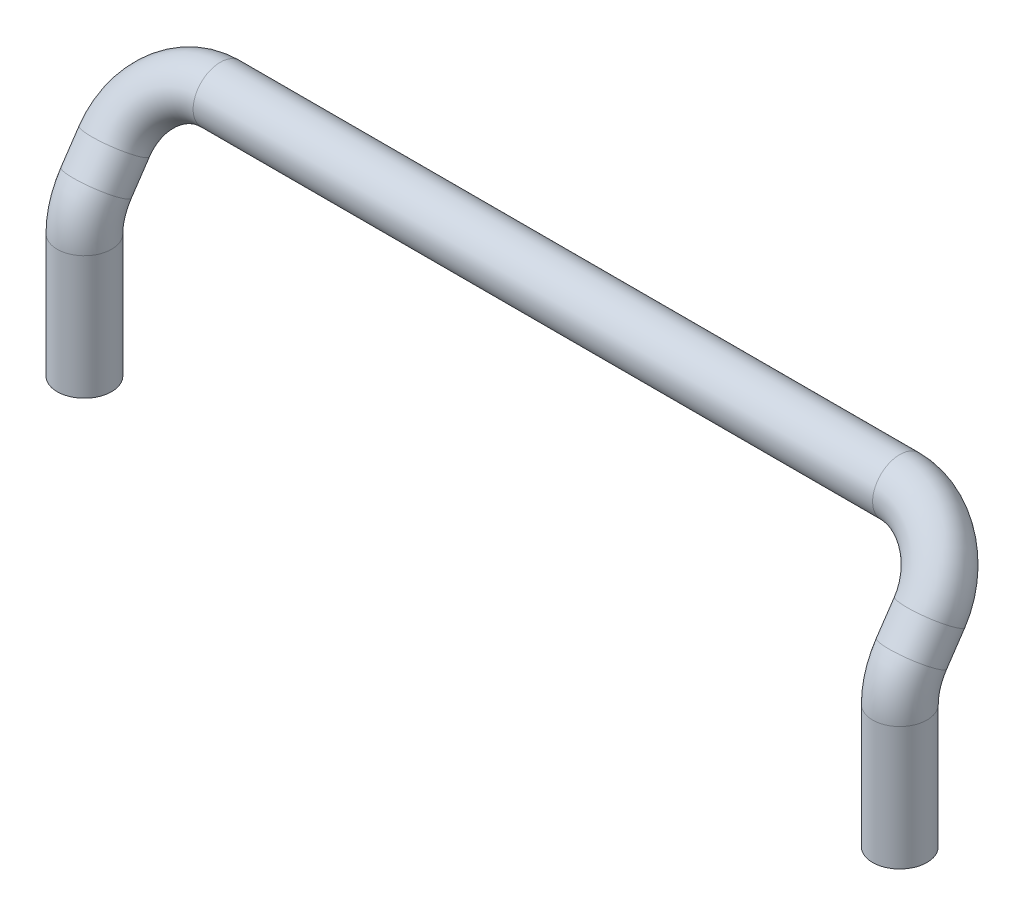
ISO-10303-21;
HEADER;
FILE_DESCRIPTION(('STEP AP214'),'2;1');
FILE_NAME('part.step','',(''),(''),'','','');
FILE_SCHEMA(('AUTOMOTIVE_DESIGN { 1 0 10303 214 1 1 1 1 }'));
ENDSEC;
DATA;
#1=APPLICATION_CONTEXT('core data for automotive mechanical design processes');
#2=APPLICATION_PROTOCOL_DEFINITION('international standard','automotive_design',2000,#1);
#3=PRODUCT_CONTEXT('',#1,'mechanical');
#4=PRODUCT('Part','Part','',(#3));
#5=PRODUCT_RELATED_PRODUCT_CATEGORY('part','',(#4));
#6=PRODUCT_DEFINITION_FORMATION('','',#4);
#7=PRODUCT_DEFINITION_CONTEXT('part definition',#1,'design');
#8=PRODUCT_DEFINITION('design','',#6,#7);
#9=PRODUCT_DEFINITION_SHAPE('','',#8);
#10=(LENGTH_UNIT() NAMED_UNIT(*) SI_UNIT(.MILLI.,.METRE.));
#11=(NAMED_UNIT(*) PLANE_ANGLE_UNIT() SI_UNIT($,.RADIAN.));
#12=(NAMED_UNIT(*) SI_UNIT($,.STERADIAN.) SOLID_ANGLE_UNIT());
#13=UNCERTAINTY_MEASURE_WITH_UNIT(LENGTH_MEASURE(1.E-05),#10,'distance_accuracy_value','');
#14=(GEOMETRIC_REPRESENTATION_CONTEXT(3) GLOBAL_UNCERTAINTY_ASSIGNED_CONTEXT((#13)) GLOBAL_UNIT_ASSIGNED_CONTEXT((#10,
#11,#12)) REPRESENTATION_CONTEXT('',''));
#15=CARTESIAN_POINT('',(0.,0.,0.));
#16=DIRECTION('',(0.,0.,1.));
#17=DIRECTION('',(1.,0.,0.));
#18=AXIS2_PLACEMENT_3D('',#15,#16,#17);
#19=CARTESIAN_POINT('',(120.,18.16,0.));
#20=DIRECTION('',(0.,-1.,0.));
#21=DIRECTION('',(0.,0.,-1.));
#22=AXIS2_PLACEMENT_3D('',#19,#20,#21);
#23=CYLINDRICAL_SURFACE('',#22,4.);
#24=CARTESIAN_POINT('',(120.,18.16,0.));
#25=DIRECTION('',(0.,-1.,0.));
#26=DIRECTION('',(0.,0.,1.));
#27=AXIS2_PLACEMENT_3D('',#24,#25,#26);
#28=CIRCLE('',#27,4.);
#29=CARTESIAN_POINT('',(120.,18.16,3.99999999999999));
#30=VERTEX_POINT('',#29);
#31=EDGE_CURVE('E45',#30,#30,#28,.T.);
#32=ORIENTED_EDGE('',*,*,#31,.T.);
#33=EDGE_LOOP('',(#32));
#34=FACE_BOUND('',#33,.T.);
#35=CARTESIAN_POINT('',(120.,0.,0.));
#36=DIRECTION('',(0.,-1.,0.));
#37=DIRECTION('',(0.,0.,1.));
#38=AXIS2_PLACEMENT_3D('',#35,#36,#37);
#39=CIRCLE('',#38,4.);
#40=CARTESIAN_POINT('',(120.,0.,3.99999999999999));
#41=VERTEX_POINT('',#40);
#42=EDGE_CURVE('E11',#41,#41,#39,.T.);
#43=ORIENTED_EDGE('',*,*,#42,.F.);
#44=EDGE_LOOP('',(#43));
#45=FACE_BOUND('',#44,.T.);
#46=ADVANCED_FACE('F38',(#34,#45),#23,.T.);
#47=CARTESIAN_POINT('',(120.,18.16,-10.));
#48=DIRECTION('',(1.,0.,0.));
#49=DIRECTION('',(0.,1.,0.));
#50=AXIS2_PLACEMENT_3D('',#47,#48,#49);
#51=TOROIDAL_SURFACE('',#50,9.99999999999999,4.);
#52=CARTESIAN_POINT('',(120.,23.7653811659193,-1.71871374816947));
#53=DIRECTION('',(0.,-0.828128625183053,0.560538116591929));
#54=DIRECTION('',(0.,0.560538116591929,0.828128625183054));
#55=AXIS2_PLACEMENT_3D('',#52,#53,#54);
#56=CIRCLE('',#55,4.);
#57=CARTESIAN_POINT('',(120.,26.007533632287,1.59380075256275));
#58=VERTEX_POINT('',#57);
#59=EDGE_CURVE('E93',#58,#58,#56,.T.);
#60=CARTESIAN_POINT('',(120.,18.16,-10.));
#61=DIRECTION('',(1.,0.,0.));
#62=DIRECTION('',(0.,1.,0.));
#63=AXIS2_PLACEMENT_3D('',#60,#61,#62);
#64=CIRCLE('',#63,14.);
#65=EDGE_CURVE('',#58,#30,#64,.T.);
#66=ORIENTED_EDGE('',*,*,#59,.T.);
#67=ORIENTED_EDGE('',*,*,#31,.F.);
#68=ORIENTED_EDGE('',*,*,#65,.T.);
#69=ORIENTED_EDGE('',*,*,#65,.F.);
#70=EDGE_LOOP('',(#66,#68,#67,#69));
#71=FACE_BOUND('',#70,.T.);
#72=ADVANCED_FACE('F100',(#71),#51,.T.);
#73=CARTESIAN_POINT('',(120.,27.7187137481694,-4.39461883408072));
#74=DIRECTION('',(0.,-0.828128625183053,0.560538116591929));
#75=DIRECTION('',(0.,-0.560538116591929,-0.828128625183053));
#76=AXIS2_PLACEMENT_3D('',#73,#74,#75);
#77=CYLINDRICAL_SURFACE('',#76,4.);
#78=CARTESIAN_POINT('',(120.,27.7187137481694,-4.39461883408072));
#79=DIRECTION('',(0.,-0.828128625183053,0.560538116591929));
#80=DIRECTION('',(0.,0.560538116591929,0.828128625183054));
#81=AXIS2_PLACEMENT_3D('',#78,#79,#80);
#82=CIRCLE('',#81,4.);
#83=CARTESIAN_POINT('',(124.,27.7187137481694,-4.39461883408072));
#84=VERTEX_POINT('',#83);
#85=EDGE_CURVE('E90',#84,#84,#82,.T.);
#86=ORIENTED_EDGE('',*,*,#85,.T.);
#87=EDGE_LOOP('',(#86));
#88=FACE_BOUND('',#87,.T.);
#89=ORIENTED_EDGE('',*,*,#59,.F.);
#90=EDGE_LOOP('',(#89));
#91=FACE_BOUND('',#90,.T.);
#92=ADVANCED_FACE('F102',(#88,#91),#77,.T.);
#93=CARTESIAN_POINT('',(110.,27.7187137481695,-4.39461883408072));
#94=DIRECTION('',(0.,-0.560538116591929,-0.828128625183053));
#95=DIRECTION('',(0.,0.828128625183053,-0.560538116591929));
#96=AXIS2_PLACEMENT_3D('',#93,#94,#95);
#97=TOROIDAL_SURFACE('',#96,9.99999999999999,4.);
#98=CARTESIAN_POINT('',(110.,36.,-10.));
#99=DIRECTION('',(1.,0.,0.));
#100=DIRECTION('',(0.,0.560538116591929,0.828128625183053));
#101=AXIS2_PLACEMENT_3D('',#98,#99,#100);
#102=CIRCLE('',#101,4.);
#103=CARTESIAN_POINT('',(110.,39.3125145007322,-12.2421524663677));
#104=VERTEX_POINT('',#103);
#105=EDGE_CURVE('E87',#104,#104,#102,.T.);
#106=CARTESIAN_POINT('',(110.,27.7187137481695,-4.39461883408072));
#107=DIRECTION('',(0.,-0.560538116591929,-0.828128625183053));
#108=DIRECTION('',(0.,0.828128625183053,-0.560538116591929));
#109=AXIS2_PLACEMENT_3D('',#106,#107,#108);
#110=CIRCLE('',#109,14.);
#111=EDGE_CURVE('',#104,#84,#110,.T.);
#112=ORIENTED_EDGE('',*,*,#105,.T.);
#113=ORIENTED_EDGE('',*,*,#85,.F.);
#114=ORIENTED_EDGE('',*,*,#111,.T.);
#115=ORIENTED_EDGE('',*,*,#111,.F.);
#116=EDGE_LOOP('',(#112,#114,#113,#115));
#117=FACE_BOUND('',#116,.T.);
#118=ADVANCED_FACE('F108',(#117),#97,.T.);
#119=CARTESIAN_POINT('',(10.,36.,-10.));
#120=DIRECTION('',(1.,0.,0.));
#121=DIRECTION('',(0.,1.,0.));
#122=AXIS2_PLACEMENT_3D('',#119,#120,#121);
#123=CYLINDRICAL_SURFACE('',#122,4.);
#124=CARTESIAN_POINT('',(10.,36.,-10.));
#125=DIRECTION('',(1.,0.,0.));
#126=DIRECTION('',(0.,0.560538116591929,0.828128625183053));
#127=AXIS2_PLACEMENT_3D('',#124,#125,#126);
#128=CIRCLE('',#127,4.);
#129=CARTESIAN_POINT('',(10.,39.3125145007322,-12.2421524663677));
#130=VERTEX_POINT('',#129);
#131=EDGE_CURVE('E84',#130,#130,#128,.T.);
#132=ORIENTED_EDGE('',*,*,#131,.T.);
#133=EDGE_LOOP('',(#132));
#134=FACE_BOUND('',#133,.T.);
#135=ORIENTED_EDGE('',*,*,#105,.F.);
#136=EDGE_LOOP('',(#135));
#137=FACE_BOUND('',#136,.T.);
#138=ADVANCED_FACE('F114',(#134,#137),#123,.T.);
#139=CARTESIAN_POINT('',(10.,27.7187137481695,-4.39461883408072));
#140=DIRECTION('',(0.,-0.560538116591929,-0.828128625183053));
#141=DIRECTION('',(0.,0.828128625183053,-0.560538116591929));
#142=AXIS2_PLACEMENT_3D('',#139,#140,#141);
#143=TOROIDAL_SURFACE('',#142,10.,4.);
#144=CARTESIAN_POINT('',(0.,27.7187137481695,-4.39461883408072));
#145=DIRECTION('',(0.,0.828128625183053,-0.560538116591929));
#146=DIRECTION('',(0.,0.560538116591929,0.828128625183053));
#147=AXIS2_PLACEMENT_3D('',#144,#145,#146);
#148=CIRCLE('',#147,4.);
#149=CARTESIAN_POINT('',(-4.,27.7187137481695,-4.39461883408072));
#150=VERTEX_POINT('',#149);
#151=EDGE_CURVE('E81',#150,#150,#148,.T.);
#152=CARTESIAN_POINT('',(10.,27.7187137481695,-4.39461883408072));
#153=DIRECTION('',(0.,-0.560538116591929,-0.828128625183053));
#154=DIRECTION('',(0.,0.828128625183053,-0.560538116591929));
#155=AXIS2_PLACEMENT_3D('',#152,#153,#154);
#156=CIRCLE('',#155,14.);
#157=EDGE_CURVE('',#150,#130,#156,.T.);
#158=ORIENTED_EDGE('',*,*,#151,.T.);
#159=ORIENTED_EDGE('',*,*,#131,.F.);
#160=ORIENTED_EDGE('',*,*,#157,.T.);
#161=ORIENTED_EDGE('',*,*,#157,.F.);
#162=EDGE_LOOP('',(#158,#160,#159,#161));
#163=FACE_BOUND('',#162,.T.);
#164=ADVANCED_FACE('F118',(#163),#143,.T.);
#165=CARTESIAN_POINT('',(0.,23.7653811659193,-1.71871374816947));
#166=DIRECTION('',(0.,0.828128625183053,-0.560538116591928));
#167=DIRECTION('',(0.,0.560538116591929,0.828128625183053));
#168=AXIS2_PLACEMENT_3D('',#165,#166,#167);
#169=CYLINDRICAL_SURFACE('',#168,4.);
#170=CARTESIAN_POINT('',(0.,23.7653811659193,-1.71871374816947));
#171=DIRECTION('',(0.,0.828128625183053,-0.560538116591929));
#172=DIRECTION('',(0.,0.560538116591929,0.828128625183053));
#173=AXIS2_PLACEMENT_3D('',#170,#171,#172);
#174=CIRCLE('',#173,4.);
#175=CARTESIAN_POINT('',(0.,26.007533632287,1.59380075256274));
#176=VERTEX_POINT('',#175);
#177=EDGE_CURVE('E76',#176,#176,#174,.T.);
#178=ORIENTED_EDGE('',*,*,#177,.T.);
#179=EDGE_LOOP('',(#178));
#180=FACE_BOUND('',#179,.T.);
#181=ORIENTED_EDGE('',*,*,#151,.F.);
#182=EDGE_LOOP('',(#181));
#183=FACE_BOUND('',#182,.T.);
#184=ADVANCED_FACE('F122',(#180,#183),#169,.T.);
#185=CARTESIAN_POINT('',(0.,18.16,-10.));
#186=DIRECTION('',(-1.,0.,0.));
#187=DIRECTION('',(0.,0.,1.));
#188=AXIS2_PLACEMENT_3D('',#185,#186,#187);
#189=TOROIDAL_SURFACE('',#188,10.,4.);
#190=CARTESIAN_POINT('',(0.,18.16,0.));
#191=DIRECTION('',(0.,1.,0.));
#192=DIRECTION('',(0.,0.,1.));
#193=AXIS2_PLACEMENT_3D('',#190,#191,#192);
#194=CIRCLE('',#193,4.);
#195=CARTESIAN_POINT('',(0.,18.16,4.));
#196=VERTEX_POINT('',#195);
#197=EDGE_CURVE('E73',#196,#196,#194,.T.);
#198=CARTESIAN_POINT('',(0.,18.16,-10.));
#199=DIRECTION('',(-1.,0.,0.));
#200=DIRECTION('',(0.,0.,1.));
#201=AXIS2_PLACEMENT_3D('',#198,#199,#200);
#202=CIRCLE('',#201,14.);
#203=EDGE_CURVE('',#196,#176,#202,.T.);
#204=ORIENTED_EDGE('',*,*,#197,.T.);
#205=ORIENTED_EDGE('',*,*,#177,.F.);
#206=ORIENTED_EDGE('',*,*,#203,.T.);
#207=ORIENTED_EDGE('',*,*,#203,.F.);
#208=EDGE_LOOP('',(#204,#206,#205,#207));
#209=FACE_BOUND('',#208,.T.);
#210=ADVANCED_FACE('F126',(#209),#189,.T.);
#211=CARTESIAN_POINT('',(0.,18.16,0.));
#212=DIRECTION('',(0.,-1.,0.));
#213=DIRECTION('',(0.,0.,-1.));
#214=AXIS2_PLACEMENT_3D('',#211,#212,#213);
#215=CYLINDRICAL_SURFACE('',#214,4.);
#216=ORIENTED_EDGE('',*,*,#197,.F.);
#217=EDGE_LOOP('',(#216));
#218=FACE_BOUND('',#217,.T.);
#219=CARTESIAN_POINT('',(0.,0.,0.));
#220=DIRECTION('',(0.,1.,0.));
#221=DIRECTION('',(0.,0.,1.));
#222=AXIS2_PLACEMENT_3D('',#219,#220,#221);
#223=CIRCLE('',#222,4.);
#224=CARTESIAN_POINT('',(0.,0.,4.));
#225=VERTEX_POINT('',#224);
#226=EDGE_CURVE('E72',#225,#225,#223,.T.);
#227=ORIENTED_EDGE('',*,*,#226,.T.);
#228=EDGE_LOOP('',(#227));
#229=FACE_BOUND('',#228,.T.);
#230=ADVANCED_FACE('F130',(#218,#229),#215,.T.);
#231=CARTESIAN_POINT('',(120.,0.,0.));
#232=DIRECTION('',(0.,-1.,0.));
#233=DIRECTION('',(0.,0.,1.));
#234=AXIS2_PLACEMENT_3D('',#231,#232,#233);
#235=PLANE('',#234);
#236=CARTESIAN_POINT('',(120.,0.,0.));
#237=DIRECTION('',(0.,-1.,0.));
#238=DIRECTION('',(0.,0.,-1.));
#239=AXIS2_PLACEMENT_3D('',#236,#237,#238);
#240=CIRCLE('',#239,2.067);
#241=CARTESIAN_POINT('',(120.,0.,-2.067));
#242=VERTEX_POINT('',#241);
#243=EDGE_CURVE('E61',#242,#242,#240,.T.);
#244=ORIENTED_EDGE('',*,*,#243,.F.);
#245=EDGE_LOOP('',(#244));
#246=FACE_BOUND('',#245,.T.);
#247=ORIENTED_EDGE('',*,*,#42,.T.);
#248=EDGE_LOOP('',(#247));
#249=FACE_BOUND('',#248,.T.);
#250=ADVANCED_FACE('F134',(#246,#249),#235,.T.);
#251=CARTESIAN_POINT('',(0.,0.,0.));
#252=DIRECTION('',(0.,1.,0.));
#253=DIRECTION('',(0.,0.,1.));
#254=AXIS2_PLACEMENT_3D('',#251,#252,#253);
#255=PLANE('',#254);
#256=CARTESIAN_POINT('',(0.,0.,0.));
#257=DIRECTION('',(0.,-1.,0.));
#258=DIRECTION('',(0.,0.,-1.));
#259=AXIS2_PLACEMENT_3D('',#256,#257,#258);
#260=CIRCLE('',#259,2.067);
#261=CARTESIAN_POINT('',(0.,0.,-2.067));
#262=VERTEX_POINT('',#261);
#263=EDGE_CURVE('E62',#262,#262,#260,.T.);
#264=ORIENTED_EDGE('',*,*,#263,.F.);
#265=EDGE_LOOP('',(#264));
#266=FACE_BOUND('',#265,.T.);
#267=ORIENTED_EDGE('',*,*,#226,.F.);
#268=EDGE_LOOP('',(#267));
#269=FACE_BOUND('',#268,.T.);
#270=ADVANCED_FACE('F136',(#266,#269),#255,.F.);
#271=CARTESIAN_POINT('',(120.,12.,0.));
#272=DIRECTION('',(0.,-1.,0.));
#273=DIRECTION('',(0.,0.,-1.));
#274=AXIS2_PLACEMENT_3D('',#271,#272,#273);
#275=CONICAL_SURFACE('',#274,2.067,1.02974425867665);
#276=CARTESIAN_POINT('',(120.,13.24197889953,0.));
#277=VERTEX_POINT('',#276);
#278=VERTEX_LOOP('',#277);
#279=FACE_BOUND('',#278,.T.);
#280=CARTESIAN_POINT('',(120.,12.,0.));
#281=DIRECTION('',(0.,-1.,0.));
#282=DIRECTION('',(0.,0.,-1.));
#283=AXIS2_PLACEMENT_3D('',#280,#281,#282);
#284=CIRCLE('',#283,2.067);
#285=CARTESIAN_POINT('',(120.,12.,-2.067));
#286=VERTEX_POINT('',#285);
#287=EDGE_CURVE('E65',#286,#286,#284,.T.);
#288=ORIENTED_EDGE('',*,*,#287,.T.);
#289=EDGE_LOOP('',(#288));
#290=FACE_BOUND('',#289,.T.);
#291=ADVANCED_FACE('F139',(#279,#290),#275,.F.);
#292=CARTESIAN_POINT('',(120.,0.,0.));
#293=DIRECTION('',(0.,-1.,0.));
#294=DIRECTION('',(0.,0.,-1.));
#295=AXIS2_PLACEMENT_3D('',#292,#293,#294);
#296=CYLINDRICAL_SURFACE('',#295,2.067);
#297=ORIENTED_EDGE('',*,*,#287,.F.);
#298=EDGE_LOOP('',(#297));
#299=FACE_BOUND('',#298,.T.);
#300=ORIENTED_EDGE('',*,*,#243,.T.);
#301=EDGE_LOOP('',(#300));
#302=FACE_BOUND('',#301,.T.);
#303=ADVANCED_FACE('F55',(#299,#302),#296,.F.);
#304=CARTESIAN_POINT('',(0.,12.,0.));
#305=DIRECTION('',(0.,-1.,0.));
#306=DIRECTION('',(0.,0.,-1.));
#307=AXIS2_PLACEMENT_3D('',#304,#305,#306);
#308=CONICAL_SURFACE('',#307,2.067,1.02974425867665);
#309=CARTESIAN_POINT('',(0.,13.24197889953,0.));
#310=VERTEX_POINT('',#309);
#311=VERTEX_LOOP('',#310);
#312=FACE_BOUND('',#311,.T.);
#313=CARTESIAN_POINT('',(0.,12.,0.));
#314=DIRECTION('',(0.,-1.,0.));
#315=DIRECTION('',(0.,0.,-1.));
#316=AXIS2_PLACEMENT_3D('',#313,#314,#315);
#317=CIRCLE('',#316,2.067);
#318=CARTESIAN_POINT('',(0.,12.,-2.067));
#319=VERTEX_POINT('',#318);
#320=EDGE_CURVE('E59',#319,#319,#317,.T.);
#321=ORIENTED_EDGE('',*,*,#320,.T.);
#322=EDGE_LOOP('',(#321));
#323=FACE_BOUND('',#322,.T.);
#324=ADVANCED_FACE('F51',(#312,#323),#308,.F.);
#325=CARTESIAN_POINT('',(0.,0.,0.));
#326=DIRECTION('',(0.,-1.,0.));
#327=DIRECTION('',(0.,0.,-1.));
#328=AXIS2_PLACEMENT_3D('',#325,#326,#327);
#329=CYLINDRICAL_SURFACE('',#328,2.067);
#330=ORIENTED_EDGE('',*,*,#320,.F.);
#331=EDGE_LOOP('',(#330));
#332=FACE_BOUND('',#331,.T.);
#333=ORIENTED_EDGE('',*,*,#263,.T.);
#334=EDGE_LOOP('',(#333));
#335=FACE_BOUND('',#334,.T.);
#336=ADVANCED_FACE('F54',(#332,#335),#329,.F.);
#337=CLOSED_SHELL('',(#46,#72,#92,#118,#138,#164,#184,#210,#230,#250,#270,#291,#303,#324,#336));
#338=MANIFOLD_SOLID_BREP('B2',#337);
#339=ADVANCED_BREP_SHAPE_REPRESENTATION('',(#18,#338),#14);
#340=SHAPE_DEFINITION_REPRESENTATION(#9,#339);
ENDSEC;
END-ISO-10303-21;
